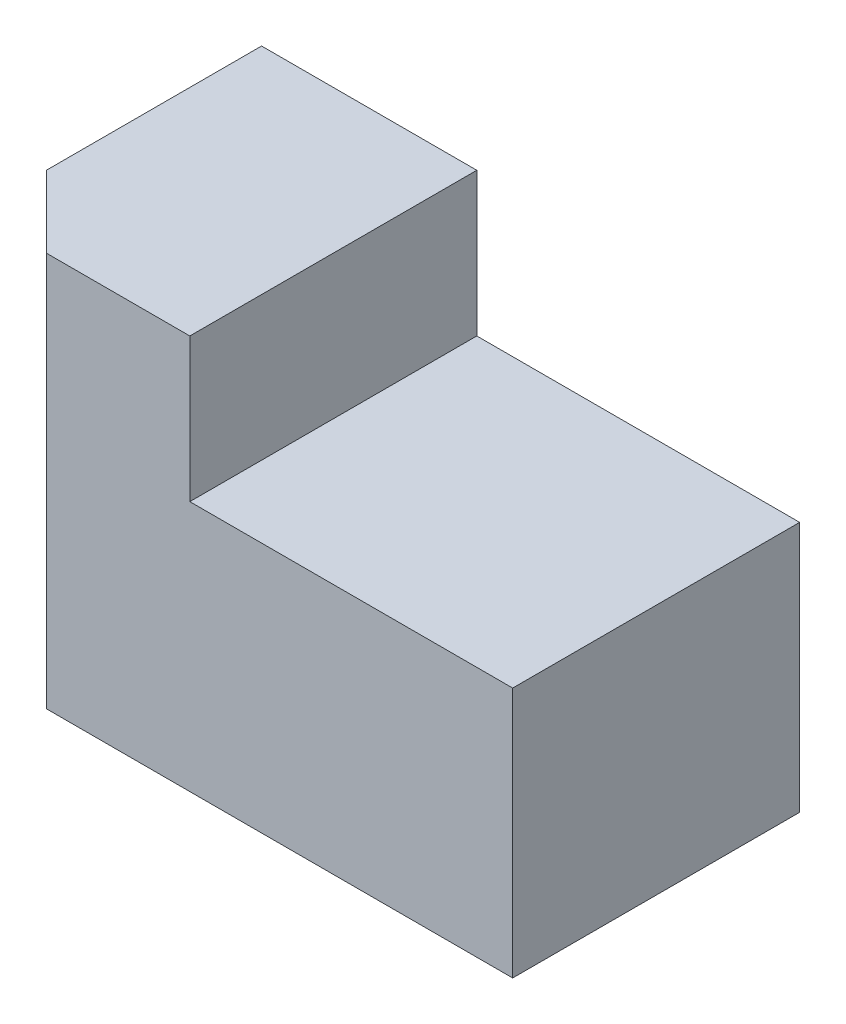
ISO-10303-21;
HEADER;
FILE_DESCRIPTION(('STEP AP214'),'2;1');
FILE_NAME('part.step','',(''),(''),'','','');
FILE_SCHEMA(('AUTOMOTIVE_DESIGN { 1 0 10303 214 1 1 1 1 }'));
ENDSEC;
DATA;
#1=APPLICATION_CONTEXT('core data for automotive mechanical design processes');
#2=APPLICATION_PROTOCOL_DEFINITION('international standard','automotive_design',2000,#1);
#3=PRODUCT_CONTEXT('',#1,'mechanical');
#4=PRODUCT('Part','Part','',(#3));
#5=PRODUCT_RELATED_PRODUCT_CATEGORY('part','',(#4));
#6=PRODUCT_DEFINITION_FORMATION('','',#4);
#7=PRODUCT_DEFINITION_CONTEXT('part definition',#1,'design');
#8=PRODUCT_DEFINITION('design','',#6,#7);
#9=PRODUCT_DEFINITION_SHAPE('','',#8);
#10=(LENGTH_UNIT() NAMED_UNIT(*) SI_UNIT(.MILLI.,.METRE.));
#11=(NAMED_UNIT(*) PLANE_ANGLE_UNIT() SI_UNIT($,.RADIAN.));
#12=(NAMED_UNIT(*) SI_UNIT($,.STERADIAN.) SOLID_ANGLE_UNIT());
#13=UNCERTAINTY_MEASURE_WITH_UNIT(LENGTH_MEASURE(1.E-05),#10,'distance_accuracy_value','');
#14=(GEOMETRIC_REPRESENTATION_CONTEXT(3) GLOBAL_UNCERTAINTY_ASSIGNED_CONTEXT((#13)) GLOBAL_UNIT_ASSIGNED_CONTEXT((#10,
#11,#12)) REPRESENTATION_CONTEXT('',''));
#15=CARTESIAN_POINT('',(0.,0.,0.));
#16=DIRECTION('',(0.,0.,1.));
#17=DIRECTION('',(1.,0.,0.));
#18=AXIS2_PLACEMENT_3D('',#15,#16,#17);
#19=CARTESIAN_POINT('',(0.,0.,0.));
#20=DIRECTION('',(0.,-1.,0.));
#21=DIRECTION('',(0.,0.,-1.));
#22=AXIS2_PLACEMENT_3D('',#19,#20,#21);
#23=PLANE('',#22);
#24=DIRECTION('',(0.707106781186548,0.,0.707106781186547));
#25=VECTOR('',#24,1.);
#26=CARTESIAN_POINT('',(12.7,0.,12.7));
#27=LINE('',#26,#25);
#28=CARTESIAN_POINT('',(0.,0.,0.));
#29=VERTEX_POINT('',#28);
#30=CARTESIAN_POINT('',(12.7,0.,12.7));
#31=VERTEX_POINT('',#30);
#32=EDGE_CURVE('E375',#29,#31,#27,.T.);
#33=ORIENTED_EDGE('',*,*,#32,.F.);
#34=DIRECTION('',(0.,0.,1.));
#35=VECTOR('',#34,1.);
#36=CARTESIAN_POINT('',(0.,0.,0.));
#37=LINE('',#36,#35);
#38=CARTESIAN_POINT('',(0.,0.,-38.1));
#39=VERTEX_POINT('',#38);
#40=EDGE_CURVE('E380',#39,#29,#37,.T.);
#41=ORIENTED_EDGE('',*,*,#40,.F.);
#42=DIRECTION('',(-1.,0.,0.));
#43=VECTOR('',#42,1.);
#44=CARTESIAN_POINT('',(0.,0.,-38.1));
#45=LINE('',#44,#43);
#46=CARTESIAN_POINT('',(95.25,0.,-38.1));
#47=VERTEX_POINT('',#46);
#48=EDGE_CURVE('E393',#47,#39,#45,.T.);
#49=ORIENTED_EDGE('',*,*,#48,.F.);
#50=DIRECTION('',(0.,0.,-1.));
#51=VECTOR('',#50,1.);
#52=CARTESIAN_POINT('',(95.25,0.,12.7));
#53=LINE('',#52,#51);
#54=CARTESIAN_POINT('',(95.25,0.,12.7));
#55=VERTEX_POINT('',#54);
#56=EDGE_CURVE('E360',#55,#47,#53,.T.);
#57=ORIENTED_EDGE('',*,*,#56,.F.);
#58=DIRECTION('',(1.,0.,0.));
#59=VECTOR('',#58,1.);
#60=CARTESIAN_POINT('',(12.7,0.,12.7));
#61=LINE('',#60,#59);
#62=EDGE_CURVE('E391',#31,#55,#61,.T.);
#63=ORIENTED_EDGE('',*,*,#62,.F.);
#64=EDGE_LOOP('',(#33,#41,#49,#57,#63));
#65=FACE_BOUND('',#64,.T.);
#66=DIRECTION('',(1.,0.,0.));
#67=VECTOR('',#66,1.);
#68=CARTESIAN_POINT('',(50.8,0.,-31.75));
#69=LINE('',#68,#67);
#70=CARTESIAN_POINT('',(50.8,0.,-31.75));
#71=VERTEX_POINT('',#70);
#72=CARTESIAN_POINT('',(57.15,0.,-31.75));
#73=VERTEX_POINT('',#72);
#74=EDGE_CURVE('E341',#71,#73,#69,.T.);
#75=ORIENTED_EDGE('',*,*,#74,.F.);
#76=DIRECTION('',(0.,0.,-1.));
#77=VECTOR('',#76,1.);
#78=CARTESIAN_POINT('',(50.8,0.,6.35000000000001));
#79=LINE('',#78,#77);
#80=CARTESIAN_POINT('',(50.8,0.,6.35000000000001));
#81=VERTEX_POINT('',#80);
#82=EDGE_CURVE('E327',#81,#71,#79,.T.);
#83=ORIENTED_EDGE('',*,*,#82,.F.);
#84=DIRECTION('',(-1.,0.,0.));
#85=VECTOR('',#84,1.);
#86=CARTESIAN_POINT('',(50.8,0.,6.35000000000001));
#87=LINE('',#86,#85);
#88=CARTESIAN_POINT('',(57.15,0.,6.35000000000001));
#89=VERTEX_POINT('',#88);
#90=EDGE_CURVE('E332',#89,#81,#87,.T.);
#91=ORIENTED_EDGE('',*,*,#90,.F.);
#92=DIRECTION('',(0.,0.,1.));
#93=VECTOR('',#92,1.);
#94=CARTESIAN_POINT('',(57.15,0.,6.35000000000001));
#95=LINE('',#94,#93);
#96=EDGE_CURVE('E343',#73,#89,#95,.T.);
#97=ORIENTED_EDGE('',*,*,#96,.F.);
#98=EDGE_LOOP('',(#75,#83,#91,#97));
#99=FACE_BOUND('',#98,.T.);
#100=DIRECTION('',(1.,0.,0.));
#101=VECTOR('',#100,1.);
#102=CARTESIAN_POINT('',(38.1,0.,-31.75));
#103=LINE('',#102,#101);
#104=CARTESIAN_POINT('',(38.1,0.,-31.75));
#105=VERTEX_POINT('',#104);
#106=CARTESIAN_POINT('',(44.45,0.,-31.75));
#107=VERTEX_POINT('',#106);
#108=EDGE_CURVE('E312',#105,#107,#103,.T.);
#109=ORIENTED_EDGE('',*,*,#108,.F.);
#110=DIRECTION('',(0.,0.,-1.));
#111=VECTOR('',#110,1.);
#112=CARTESIAN_POINT('',(38.1,0.,6.35000000000001));
#113=LINE('',#112,#111);
#114=CARTESIAN_POINT('',(38.1,0.,6.35000000000001));
#115=VERTEX_POINT('',#114);
#116=EDGE_CURVE('E298',#115,#105,#113,.T.);
#117=ORIENTED_EDGE('',*,*,#116,.F.);
#118=DIRECTION('',(-1.,0.,0.));
#119=VECTOR('',#118,1.);
#120=CARTESIAN_POINT('',(38.1,0.,6.35000000000001));
#121=LINE('',#120,#119);
#122=CARTESIAN_POINT('',(44.45,0.,6.35000000000001));
#123=VERTEX_POINT('',#122);
#124=EDGE_CURVE('E303',#123,#115,#121,.T.);
#125=ORIENTED_EDGE('',*,*,#124,.F.);
#126=DIRECTION('',(0.,0.,1.));
#127=VECTOR('',#126,1.);
#128=CARTESIAN_POINT('',(44.45,0.,6.35000000000001));
#129=LINE('',#128,#127);
#130=EDGE_CURVE('E314',#107,#123,#129,.T.);
#131=ORIENTED_EDGE('',*,*,#130,.F.);
#132=EDGE_LOOP('',(#109,#117,#125,#131));
#133=FACE_BOUND('',#132,.T.);
#134=DIRECTION('',(1.,0.,0.));
#135=VECTOR('',#134,1.);
#136=CARTESIAN_POINT('',(25.4,0.,-31.75));
#137=LINE('',#136,#135);
#138=CARTESIAN_POINT('',(25.4,0.,-31.75));
#139=VERTEX_POINT('',#138);
#140=CARTESIAN_POINT('',(31.75,0.,-31.75));
#141=VERTEX_POINT('',#140);
#142=EDGE_CURVE('E283',#139,#141,#137,.T.);
#143=ORIENTED_EDGE('',*,*,#142,.F.);
#144=DIRECTION('',(0.,0.,-1.));
#145=VECTOR('',#144,1.);
#146=CARTESIAN_POINT('',(25.4,0.,6.35));
#147=LINE('',#146,#145);
#148=CARTESIAN_POINT('',(25.4,0.,6.35));
#149=VERTEX_POINT('',#148);
#150=EDGE_CURVE('E269',#149,#139,#147,.T.);
#151=ORIENTED_EDGE('',*,*,#150,.F.);
#152=DIRECTION('',(-1.,0.,0.));
#153=VECTOR('',#152,1.);
#154=CARTESIAN_POINT('',(25.4,0.,6.35));
#155=LINE('',#154,#153);
#156=CARTESIAN_POINT('',(31.75,0.,6.35));
#157=VERTEX_POINT('',#156);
#158=EDGE_CURVE('E274',#157,#149,#155,.T.);
#159=ORIENTED_EDGE('',*,*,#158,.F.);
#160=DIRECTION('',(0.,0.,1.));
#161=VECTOR('',#160,1.);
#162=CARTESIAN_POINT('',(31.75,0.,6.35));
#163=LINE('',#162,#161);
#164=EDGE_CURVE('E285',#141,#157,#163,.T.);
#165=ORIENTED_EDGE('',*,*,#164,.F.);
#166=EDGE_LOOP('',(#143,#151,#159,#165));
#167=FACE_BOUND('',#166,.T.);
#168=DIRECTION('',(1.,0.,0.));
#169=VECTOR('',#168,1.);
#170=CARTESIAN_POINT('',(63.5,0.,-31.75));
#171=LINE('',#170,#169);
#172=CARTESIAN_POINT('',(63.5,0.,-31.75));
#173=VERTEX_POINT('',#172);
#174=CARTESIAN_POINT('',(69.85,0.,-31.75));
#175=VERTEX_POINT('',#174);
#176=EDGE_CURVE('E241',#173,#175,#171,.T.);
#177=ORIENTED_EDGE('',*,*,#176,.F.);
#178=DIRECTION('',(0.,0.,-1.));
#179=VECTOR('',#178,1.);
#180=CARTESIAN_POINT('',(63.5,0.,6.35000000000001));
#181=LINE('',#180,#179);
#182=CARTESIAN_POINT('',(63.5,0.,6.35000000000001));
#183=VERTEX_POINT('',#182);
#184=EDGE_CURVE('E238',#183,#173,#181,.T.);
#185=ORIENTED_EDGE('',*,*,#184,.F.);
#186=DIRECTION('',(-1.,0.,0.));
#187=VECTOR('',#186,1.);
#188=CARTESIAN_POINT('',(63.5,0.,6.35000000000001));
#189=LINE('',#188,#187);
#190=CARTESIAN_POINT('',(69.85,0.,6.35000000000001));
#191=VERTEX_POINT('',#190);
#192=EDGE_CURVE('E250',#191,#183,#189,.T.);
#193=ORIENTED_EDGE('',*,*,#192,.F.);
#194=DIRECTION('',(0.,0.,1.));
#195=VECTOR('',#194,1.);
#196=CARTESIAN_POINT('',(69.85,0.,6.35000000000001));
#197=LINE('',#196,#195);
#198=EDGE_CURVE('E258',#175,#191,#197,.T.);
#199=ORIENTED_EDGE('',*,*,#198,.F.);
#200=EDGE_LOOP('',(#177,#185,#193,#199));
#201=FACE_BOUND('',#200,.T.);
#202=DIRECTION('',(1.,0.,0.));
#203=VECTOR('',#202,1.);
#204=CARTESIAN_POINT('',(76.2,0.,-31.75));
#205=LINE('',#204,#203);
#206=CARTESIAN_POINT('',(76.2,0.,-31.75));
#207=VERTEX_POINT('',#206);
#208=CARTESIAN_POINT('',(82.55,0.,-31.75));
#209=VERTEX_POINT('',#208);
#210=EDGE_CURVE('E765',#207,#209,#205,.T.);
#211=ORIENTED_EDGE('',*,*,#210,.F.);
#212=DIRECTION('',(0.,0.,-1.));
#213=VECTOR('',#212,1.);
#214=CARTESIAN_POINT('',(76.2,0.,6.35000000000001));
#215=LINE('',#214,#213);
#216=CARTESIAN_POINT('',(76.2,0.,6.35000000000001));
#217=VERTEX_POINT('',#216);
#218=EDGE_CURVE('E236',#217,#207,#215,.T.);
#219=ORIENTED_EDGE('',*,*,#218,.F.);
#220=DIRECTION('',(-1.,0.,0.));
#221=VECTOR('',#220,1.);
#222=CARTESIAN_POINT('',(76.2,0.,6.35000000000001));
#223=LINE('',#222,#221);
#224=CARTESIAN_POINT('',(82.55,0.,6.35000000000001));
#225=VERTEX_POINT('',#224);
#226=EDGE_CURVE('E232',#225,#217,#223,.T.);
#227=ORIENTED_EDGE('',*,*,#226,.F.);
#228=DIRECTION('',(0.,0.,1.));
#229=VECTOR('',#228,1.);
#230=CARTESIAN_POINT('',(82.55,0.,6.35000000000001));
#231=LINE('',#230,#229);
#232=EDGE_CURVE('E762',#209,#225,#231,.T.);
#233=ORIENTED_EDGE('',*,*,#232,.F.);
#234=EDGE_LOOP('',(#211,#219,#227,#233));
#235=FACE_BOUND('',#234,.T.);
#236=ADVANCED_FACE('F33',(#65,#99,#133,#167,#201,#235),#23,.T.);
#237=CARTESIAN_POINT('',(38.1,69.85,-38.1));
#238=DIRECTION('',(-1.,0.,0.));
#239=DIRECTION('',(0.,0.,1.));
#240=AXIS2_PLACEMENT_3D('',#237,#238,#239);
#241=PLANE('',#240);
#242=DIRECTION('',(0.,0.,1.));
#243=VECTOR('',#242,1.);
#244=CARTESIAN_POINT('',(38.1,44.45,12.7));
#245=LINE('',#244,#243);
#246=CARTESIAN_POINT('',(38.1,44.45,-38.1));
#247=VERTEX_POINT('',#246);
#248=CARTESIAN_POINT('',(38.1,44.45,12.7));
#249=VERTEX_POINT('',#248);
#250=EDGE_CURVE('E356',#247,#249,#245,.T.);
#251=ORIENTED_EDGE('',*,*,#250,.F.);
#252=DIRECTION('',(0.,-1.,0.));
#253=VECTOR('',#252,1.);
#254=CARTESIAN_POINT('',(38.1,69.85,-38.1));
#255=LINE('',#254,#253);
#256=CARTESIAN_POINT('',(38.1,69.85,-38.1));
#257=VERTEX_POINT('',#256);
#258=EDGE_CURVE('E401',#257,#247,#255,.T.);
#259=ORIENTED_EDGE('',*,*,#258,.F.);
#260=DIRECTION('',(0.,0.,-1.));
#261=VECTOR('',#260,1.);
#262=CARTESIAN_POINT('',(38.1,69.85,-38.1));
#263=LINE('',#262,#261);
#264=CARTESIAN_POINT('',(38.1,69.85,12.7));
#265=VERTEX_POINT('',#264);
#266=EDGE_CURVE('E382',#265,#257,#263,.T.);
#267=ORIENTED_EDGE('',*,*,#266,.F.);
#268=DIRECTION('',(0.,-1.,0.));
#269=VECTOR('',#268,1.);
#270=CARTESIAN_POINT('',(38.1,69.85,12.7));
#271=LINE('',#270,#269);
#272=EDGE_CURVE('E41',#265,#249,#271,.T.);
#273=ORIENTED_EDGE('',*,*,#272,.T.);
#274=EDGE_LOOP('',(#251,#259,#267,#273));
#275=FACE_BOUND('',#274,.T.);
#276=ADVANCED_FACE('F406',(#275),#241,.F.);
#277=CARTESIAN_POINT('',(12.7,69.85,12.7));
#278=DIRECTION('',(0.707106781186547,0.,-0.707106781186548));
#279=DIRECTION('',(-0.707106781186548,0.,-0.707106781186547));
#280=AXIS2_PLACEMENT_3D('',#277,#278,#279);
#281=PLANE('',#280);
#282=ORIENTED_EDGE('',*,*,#32,.T.);
#283=DIRECTION('',(0.,-1.,0.));
#284=VECTOR('',#283,1.);
#285=CARTESIAN_POINT('',(12.7,69.85,12.7));
#286=LINE('',#285,#284);
#287=CARTESIAN_POINT('',(12.7,69.85,12.7));
#288=VERTEX_POINT('',#287);
#289=EDGE_CURVE('E11',#288,#31,#286,.T.);
#290=ORIENTED_EDGE('',*,*,#289,.F.);
#291=DIRECTION('',(0.707106781186548,0.,0.707106781186547));
#292=VECTOR('',#291,1.);
#293=CARTESIAN_POINT('',(12.7,69.85,12.7));
#294=LINE('',#293,#292);
#295=CARTESIAN_POINT('',(0.,69.85,0.));
#296=VERTEX_POINT('',#295);
#297=EDGE_CURVE('E376',#296,#288,#294,.T.);
#298=ORIENTED_EDGE('',*,*,#297,.F.);
#299=DIRECTION('',(0.,-1.,0.));
#300=VECTOR('',#299,1.);
#301=CARTESIAN_POINT('',(0.,69.85,0.));
#302=LINE('',#301,#300);
#303=EDGE_CURVE('E388',#296,#29,#302,.T.);
#304=ORIENTED_EDGE('',*,*,#303,.T.);
#305=EDGE_LOOP('',(#282,#290,#298,#304));
#306=FACE_BOUND('',#305,.T.);
#307=ADVANCED_FACE('F35',(#306),#281,.F.);
#308=CARTESIAN_POINT('',(12.7,69.85,12.7));
#309=DIRECTION('',(0.,0.,-1.));
#310=DIRECTION('',(-1.,0.,0.));
#311=AXIS2_PLACEMENT_3D('',#308,#309,#310);
#312=PLANE('',#311);
#313=ORIENTED_EDGE('',*,*,#62,.T.);
#314=DIRECTION('',(0.,-1.,0.));
#315=VECTOR('',#314,1.);
#316=CARTESIAN_POINT('',(95.25,0.,12.7));
#317=LINE('',#316,#315);
#318=CARTESIAN_POINT('',(95.25,44.45,12.7));
#319=VERTEX_POINT('',#318);
#320=EDGE_CURVE('E357',#319,#55,#317,.T.);
#321=ORIENTED_EDGE('',*,*,#320,.F.);
#322=DIRECTION('',(-1.,0.,0.));
#323=VECTOR('',#322,1.);
#324=CARTESIAN_POINT('',(95.25,44.45,12.7));
#325=LINE('',#324,#323);
#326=EDGE_CURVE('E367',#319,#249,#325,.T.);
#327=ORIENTED_EDGE('',*,*,#326,.T.);
#328=ORIENTED_EDGE('',*,*,#272,.F.);
#329=DIRECTION('',(1.,0.,0.));
#330=VECTOR('',#329,1.);
#331=CARTESIAN_POINT('',(12.7,69.85,12.7));
#332=LINE('',#331,#330);
#333=EDGE_CURVE('E379',#288,#265,#332,.T.);
#334=ORIENTED_EDGE('',*,*,#333,.F.);
#335=ORIENTED_EDGE('',*,*,#289,.T.);
#336=EDGE_LOOP('',(#313,#321,#327,#328,#334,#335));
#337=FACE_BOUND('',#336,.T.);
#338=ADVANCED_FACE('F415',(#337),#312,.F.);
#339=CARTESIAN_POINT('',(0.,69.85,-38.1));
#340=DIRECTION('',(0.,0.,1.));
#341=DIRECTION('',(1.,0.,0.));
#342=AXIS2_PLACEMENT_3D('',#339,#340,#341);
#343=PLANE('',#342);
#344=ORIENTED_EDGE('',*,*,#48,.T.);
#345=DIRECTION('',(0.,-1.,0.));
#346=VECTOR('',#345,1.);
#347=CARTESIAN_POINT('',(0.,69.85,-38.1));
#348=LINE('',#347,#346);
#349=CARTESIAN_POINT('',(0.,69.85,-38.1));
#350=VERTEX_POINT('',#349);
#351=EDGE_CURVE('E398',#350,#39,#348,.T.);
#352=ORIENTED_EDGE('',*,*,#351,.F.);
#353=DIRECTION('',(-1.,0.,0.));
#354=VECTOR('',#353,1.);
#355=CARTESIAN_POINT('',(0.,69.85,-38.1));
#356=LINE('',#355,#354);
#357=EDGE_CURVE('E384',#257,#350,#356,.T.);
#358=ORIENTED_EDGE('',*,*,#357,.F.);
#359=ORIENTED_EDGE('',*,*,#258,.T.);
#360=DIRECTION('',(-1.,0.,0.));
#361=VECTOR('',#360,1.);
#362=CARTESIAN_POINT('',(95.25,44.45,-38.1));
#363=LINE('',#362,#361);
#364=CARTESIAN_POINT('',(95.25,44.45,-38.1));
#365=VERTEX_POINT('',#364);
#366=EDGE_CURVE('E372',#365,#247,#363,.T.);
#367=ORIENTED_EDGE('',*,*,#366,.F.);
#368=DIRECTION('',(0.,1.,0.));
#369=VECTOR('',#368,1.);
#370=CARTESIAN_POINT('',(95.25,0.,-38.1));
#371=LINE('',#370,#369);
#372=EDGE_CURVE('E363',#47,#365,#371,.T.);
#373=ORIENTED_EDGE('',*,*,#372,.F.);
#374=EDGE_LOOP('',(#344,#352,#358,#359,#367,#373));
#375=FACE_BOUND('',#374,.T.);
#376=ADVANCED_FACE('F421',(#375),#343,.F.);
#377=CARTESIAN_POINT('',(0.,69.85,0.));
#378=DIRECTION('',(1.,0.,0.));
#379=DIRECTION('',(0.,0.,-1.));
#380=AXIS2_PLACEMENT_3D('',#377,#378,#379);
#381=PLANE('',#380);
#382=ORIENTED_EDGE('',*,*,#40,.T.);
#383=ORIENTED_EDGE('',*,*,#303,.F.);
#384=DIRECTION('',(0.,0.,1.));
#385=VECTOR('',#384,1.);
#386=CARTESIAN_POINT('',(0.,69.85,0.));
#387=LINE('',#386,#385);
#388=EDGE_CURVE('E386',#350,#296,#387,.T.);
#389=ORIENTED_EDGE('',*,*,#388,.F.);
#390=ORIENTED_EDGE('',*,*,#351,.T.);
#391=EDGE_LOOP('',(#382,#383,#389,#390));
#392=FACE_BOUND('',#391,.T.);
#393=ADVANCED_FACE('F436',(#392),#381,.F.);
#394=CARTESIAN_POINT('',(0.,69.85,0.));
#395=DIRECTION('',(0.,-1.,0.));
#396=DIRECTION('',(0.,0.,-1.));
#397=AXIS2_PLACEMENT_3D('',#394,#395,#396);
#398=PLANE('',#397);
#399=ORIENTED_EDGE('',*,*,#297,.T.);
#400=ORIENTED_EDGE('',*,*,#333,.T.);
#401=ORIENTED_EDGE('',*,*,#266,.T.);
#402=ORIENTED_EDGE('',*,*,#357,.T.);
#403=ORIENTED_EDGE('',*,*,#388,.T.);
#404=EDGE_LOOP('',(#399,#400,#401,#402,#403));
#405=FACE_BOUND('',#404,.T.);
#406=ADVANCED_FACE('F426',(#405),#398,.F.);
#407=CARTESIAN_POINT('',(95.25,44.45,12.7));
#408=DIRECTION('',(0.,-1.,0.));
#409=DIRECTION('',(0.,0.,-1.));
#410=AXIS2_PLACEMENT_3D('',#407,#408,#409);
#411=PLANE('',#410);
#412=ORIENTED_EDGE('',*,*,#250,.T.);
#413=ORIENTED_EDGE('',*,*,#326,.F.);
#414=DIRECTION('',(0.,0.,1.));
#415=VECTOR('',#414,1.);
#416=CARTESIAN_POINT('',(95.25,44.45,12.7));
#417=LINE('',#416,#415);
#418=EDGE_CURVE('E365',#365,#319,#417,.T.);
#419=ORIENTED_EDGE('',*,*,#418,.F.);
#420=ORIENTED_EDGE('',*,*,#366,.T.);
#421=EDGE_LOOP('',(#412,#413,#419,#420));
#422=FACE_BOUND('',#421,.T.);
#423=ADVANCED_FACE('F411',(#422),#411,.F.);
#424=CARTESIAN_POINT('',(95.25,0.,0.));
#425=DIRECTION('',(-1.,0.,0.));
#426=DIRECTION('',(0.,0.,1.));
#427=AXIS2_PLACEMENT_3D('',#424,#425,#426);
#428=PLANE('',#427);
#429=ORIENTED_EDGE('',*,*,#320,.T.);
#430=ORIENTED_EDGE('',*,*,#56,.T.);
#431=ORIENTED_EDGE('',*,*,#372,.T.);
#432=ORIENTED_EDGE('',*,*,#418,.T.);
#433=EDGE_LOOP('',(#429,#430,#431,#432));
#434=FACE_BOUND('',#433,.T.);
#435=ADVANCED_FACE('F418',(#434),#428,.F.);
#436=CARTESIAN_POINT('',(50.8,-6.35,6.35000000000001));
#437=DIRECTION('',(1.,0.,0.));
#438=DIRECTION('',(0.,0.,-1.));
#439=AXIS2_PLACEMENT_3D('',#436,#437,#438);
#440=PLANE('',#439);
#441=ORIENTED_EDGE('',*,*,#82,.T.);
#442=DIRECTION('',(0.,1.,0.));
#443=VECTOR('',#442,1.);
#444=CARTESIAN_POINT('',(50.8,-6.35,-31.75));
#445=LINE('',#444,#443);
#446=CARTESIAN_POINT('',(50.8,-6.35,-31.75));
#447=VERTEX_POINT('',#446);
#448=EDGE_CURVE('E354',#447,#71,#445,.T.);
#449=ORIENTED_EDGE('',*,*,#448,.F.);
#450=DIRECTION('',(0.,0.,-1.));
#451=VECTOR('',#450,1.);
#452=CARTESIAN_POINT('',(50.8,-6.35,6.35000000000001));
#453=LINE('',#452,#451);
#454=CARTESIAN_POINT('',(50.8,-6.35,6.35000000000001));
#455=VERTEX_POINT('',#454);
#456=EDGE_CURVE('E328',#455,#447,#453,.T.);
#457=ORIENTED_EDGE('',*,*,#456,.F.);
#458=DIRECTION('',(0.,1.,0.));
#459=VECTOR('',#458,1.);
#460=CARTESIAN_POINT('',(50.8,-6.35,6.35000000000001));
#461=LINE('',#460,#459);
#462=EDGE_CURVE('E338',#455,#81,#461,.T.);
#463=ORIENTED_EDGE('',*,*,#462,.T.);
#464=EDGE_LOOP('',(#441,#449,#457,#463));
#465=FACE_BOUND('',#464,.T.);
#466=ADVANCED_FACE('F456',(#465),#440,.F.);
#467=CARTESIAN_POINT('',(50.8,-6.35,-31.75));
#468=DIRECTION('',(0.,0.,1.));
#469=DIRECTION('',(1.,0.,0.));
#470=AXIS2_PLACEMENT_3D('',#467,#468,#469);
#471=PLANE('',#470);
#472=ORIENTED_EDGE('',*,*,#74,.T.);
#473=DIRECTION('',(0.,1.,0.));
#474=VECTOR('',#473,1.);
#475=CARTESIAN_POINT('',(57.15,-6.35,-31.75));
#476=LINE('',#475,#474);
#477=CARTESIAN_POINT('',(57.15,-6.35,-31.75));
#478=VERTEX_POINT('',#477);
#479=EDGE_CURVE('E351',#478,#73,#476,.T.);
#480=ORIENTED_EDGE('',*,*,#479,.F.);
#481=DIRECTION('',(1.,0.,0.));
#482=VECTOR('',#481,1.);
#483=CARTESIAN_POINT('',(50.8,-6.35,-31.75));
#484=LINE('',#483,#482);
#485=EDGE_CURVE('E331',#447,#478,#484,.T.);
#486=ORIENTED_EDGE('',*,*,#485,.F.);
#487=ORIENTED_EDGE('',*,*,#448,.T.);
#488=EDGE_LOOP('',(#472,#480,#486,#487));
#489=FACE_BOUND('',#488,.T.);
#490=ADVANCED_FACE('F459',(#489),#471,.F.);
#491=CARTESIAN_POINT('',(57.15,-6.35,6.35000000000001));
#492=DIRECTION('',(-1.,0.,0.));
#493=DIRECTION('',(0.,0.,1.));
#494=AXIS2_PLACEMENT_3D('',#491,#492,#493);
#495=PLANE('',#494);
#496=ORIENTED_EDGE('',*,*,#96,.T.);
#497=DIRECTION('',(0.,1.,0.));
#498=VECTOR('',#497,1.);
#499=CARTESIAN_POINT('',(57.15,-6.35,6.35000000000001));
#500=LINE('',#499,#498);
#501=CARTESIAN_POINT('',(57.15,-6.35,6.35000000000001));
#502=VERTEX_POINT('',#501);
#503=EDGE_CURVE('E349',#502,#89,#500,.T.);
#504=ORIENTED_EDGE('',*,*,#503,.F.);
#505=DIRECTION('',(0.,0.,1.));
#506=VECTOR('',#505,1.);
#507=CARTESIAN_POINT('',(57.15,-6.35,6.35000000000001));
#508=LINE('',#507,#506);
#509=EDGE_CURVE('E334',#478,#502,#508,.T.);
#510=ORIENTED_EDGE('',*,*,#509,.F.);
#511=ORIENTED_EDGE('',*,*,#479,.T.);
#512=EDGE_LOOP('',(#496,#504,#510,#511));
#513=FACE_BOUND('',#512,.T.);
#514=ADVANCED_FACE('F463',(#513),#495,.F.);
#515=CARTESIAN_POINT('',(50.8,-6.35,6.35000000000001));
#516=DIRECTION('',(0.,0.,-1.));
#517=DIRECTION('',(-1.,0.,0.));
#518=AXIS2_PLACEMENT_3D('',#515,#516,#517);
#519=PLANE('',#518);
#520=ORIENTED_EDGE('',*,*,#90,.T.);
#521=ORIENTED_EDGE('',*,*,#462,.F.);
#522=DIRECTION('',(-1.,0.,0.));
#523=VECTOR('',#522,1.);
#524=CARTESIAN_POINT('',(50.8,-6.35,6.35000000000001));
#525=LINE('',#524,#523);
#526=EDGE_CURVE('E336',#502,#455,#525,.T.);
#527=ORIENTED_EDGE('',*,*,#526,.F.);
#528=ORIENTED_EDGE('',*,*,#503,.T.);
#529=EDGE_LOOP('',(#520,#521,#527,#528));
#530=FACE_BOUND('',#529,.T.);
#531=ADVANCED_FACE('F467',(#530),#519,.F.);
#532=CARTESIAN_POINT('',(0.,-6.35,0.));
#533=DIRECTION('',(0.,-1.,0.));
#534=DIRECTION('',(0.,0.,-1.));
#535=AXIS2_PLACEMENT_3D('',#532,#533,#534);
#536=PLANE('',#535);
#537=ORIENTED_EDGE('',*,*,#456,.T.);
#538=ORIENTED_EDGE('',*,*,#485,.T.);
#539=ORIENTED_EDGE('',*,*,#509,.T.);
#540=ORIENTED_EDGE('',*,*,#526,.T.);
#541=EDGE_LOOP('',(#537,#538,#539,#540));
#542=FACE_BOUND('',#541,.T.);
#543=ADVANCED_FACE('F471',(#542),#536,.T.);
#544=CARTESIAN_POINT('',(38.1,-6.35,6.35000000000001));
#545=DIRECTION('',(1.,0.,0.));
#546=DIRECTION('',(0.,0.,-1.));
#547=AXIS2_PLACEMENT_3D('',#544,#545,#546);
#548=PLANE('',#547);
#549=ORIENTED_EDGE('',*,*,#116,.T.);
#550=DIRECTION('',(0.,1.,0.));
#551=VECTOR('',#550,1.);
#552=CARTESIAN_POINT('',(38.1,-6.35,-31.75));
#553=LINE('',#552,#551);
#554=CARTESIAN_POINT('',(38.1,-6.35,-31.75));
#555=VERTEX_POINT('',#554);
#556=EDGE_CURVE('E325',#555,#105,#553,.T.);
#557=ORIENTED_EDGE('',*,*,#556,.F.);
#558=DIRECTION('',(0.,0.,-1.));
#559=VECTOR('',#558,1.);
#560=CARTESIAN_POINT('',(38.1,-6.35,6.35000000000001));
#561=LINE('',#560,#559);
#562=CARTESIAN_POINT('',(38.1,-6.35,6.35000000000001));
#563=VERTEX_POINT('',#562);
#564=EDGE_CURVE('E299',#563,#555,#561,.T.);
#565=ORIENTED_EDGE('',*,*,#564,.F.);
#566=DIRECTION('',(0.,1.,0.));
#567=VECTOR('',#566,1.);
#568=CARTESIAN_POINT('',(38.1,-6.35,6.35000000000001));
#569=LINE('',#568,#567);
#570=EDGE_CURVE('E309',#563,#115,#569,.T.);
#571=ORIENTED_EDGE('',*,*,#570,.T.);
#572=EDGE_LOOP('',(#549,#557,#565,#571));
#573=FACE_BOUND('',#572,.T.);
#574=ADVANCED_FACE('F475',(#573),#548,.F.);
#575=CARTESIAN_POINT('',(38.1,-6.35,-31.75));
#576=DIRECTION('',(0.,0.,1.));
#577=DIRECTION('',(1.,0.,0.));
#578=AXIS2_PLACEMENT_3D('',#575,#576,#577);
#579=PLANE('',#578);
#580=ORIENTED_EDGE('',*,*,#108,.T.);
#581=DIRECTION('',(0.,1.,0.));
#582=VECTOR('',#581,1.);
#583=CARTESIAN_POINT('',(44.45,-6.35,-31.75));
#584=LINE('',#583,#582);
#585=CARTESIAN_POINT('',(44.45,-6.35,-31.75));
#586=VERTEX_POINT('',#585);
#587=EDGE_CURVE('E322',#586,#107,#584,.T.);
#588=ORIENTED_EDGE('',*,*,#587,.F.);
#589=DIRECTION('',(1.,0.,0.));
#590=VECTOR('',#589,1.);
#591=CARTESIAN_POINT('',(38.1,-6.35,-31.75));
#592=LINE('',#591,#590);
#593=EDGE_CURVE('E302',#555,#586,#592,.T.);
#594=ORIENTED_EDGE('',*,*,#593,.F.);
#595=ORIENTED_EDGE('',*,*,#556,.T.);
#596=EDGE_LOOP('',(#580,#588,#594,#595));
#597=FACE_BOUND('',#596,.T.);
#598=ADVANCED_FACE('F479',(#597),#579,.F.);
#599=CARTESIAN_POINT('',(44.45,-6.35,6.35000000000001));
#600=DIRECTION('',(-1.,0.,0.));
#601=DIRECTION('',(0.,0.,1.));
#602=AXIS2_PLACEMENT_3D('',#599,#600,#601);
#603=PLANE('',#602);
#604=ORIENTED_EDGE('',*,*,#130,.T.);
#605=DIRECTION('',(0.,1.,0.));
#606=VECTOR('',#605,1.);
#607=CARTESIAN_POINT('',(44.45,-6.35,6.35000000000001));
#608=LINE('',#607,#606);
#609=CARTESIAN_POINT('',(44.45,-6.35,6.35000000000001));
#610=VERTEX_POINT('',#609);
#611=EDGE_CURVE('E320',#610,#123,#608,.T.);
#612=ORIENTED_EDGE('',*,*,#611,.F.);
#613=DIRECTION('',(0.,0.,1.));
#614=VECTOR('',#613,1.);
#615=CARTESIAN_POINT('',(44.45,-6.35,6.35000000000001));
#616=LINE('',#615,#614);
#617=EDGE_CURVE('E305',#586,#610,#616,.T.);
#618=ORIENTED_EDGE('',*,*,#617,.F.);
#619=ORIENTED_EDGE('',*,*,#587,.T.);
#620=EDGE_LOOP('',(#604,#612,#618,#619));
#621=FACE_BOUND('',#620,.T.);
#622=ADVANCED_FACE('F483',(#621),#603,.F.);
#623=CARTESIAN_POINT('',(38.1,-6.35,6.35000000000001));
#624=DIRECTION('',(0.,0.,-1.));
#625=DIRECTION('',(-1.,0.,0.));
#626=AXIS2_PLACEMENT_3D('',#623,#624,#625);
#627=PLANE('',#626);
#628=ORIENTED_EDGE('',*,*,#124,.T.);
#629=ORIENTED_EDGE('',*,*,#570,.F.);
#630=DIRECTION('',(-1.,0.,0.));
#631=VECTOR('',#630,1.);
#632=CARTESIAN_POINT('',(38.1,-6.35,6.35000000000001));
#633=LINE('',#632,#631);
#634=EDGE_CURVE('E307',#610,#563,#633,.T.);
#635=ORIENTED_EDGE('',*,*,#634,.F.);
#636=ORIENTED_EDGE('',*,*,#611,.T.);
#637=EDGE_LOOP('',(#628,#629,#635,#636));
#638=FACE_BOUND('',#637,.T.);
#639=ADVANCED_FACE('F487',(#638),#627,.F.);
#640=CARTESIAN_POINT('',(0.,-6.35,0.));
#641=DIRECTION('',(0.,-1.,0.));
#642=DIRECTION('',(0.,0.,-1.));
#643=AXIS2_PLACEMENT_3D('',#640,#641,#642);
#644=PLANE('',#643);
#645=ORIENTED_EDGE('',*,*,#564,.T.);
#646=ORIENTED_EDGE('',*,*,#593,.T.);
#647=ORIENTED_EDGE('',*,*,#617,.T.);
#648=ORIENTED_EDGE('',*,*,#634,.T.);
#649=EDGE_LOOP('',(#645,#646,#647,#648));
#650=FACE_BOUND('',#649,.T.);
#651=ADVANCED_FACE('F491',(#650),#644,.T.);
#652=CARTESIAN_POINT('',(25.4,-6.35,6.35));
#653=DIRECTION('',(1.,0.,0.));
#654=DIRECTION('',(0.,0.,-1.));
#655=AXIS2_PLACEMENT_3D('',#652,#653,#654);
#656=PLANE('',#655);
#657=ORIENTED_EDGE('',*,*,#150,.T.);
#658=DIRECTION('',(0.,1.,0.));
#659=VECTOR('',#658,1.);
#660=CARTESIAN_POINT('',(25.4,-6.35,-31.75));
#661=LINE('',#660,#659);
#662=CARTESIAN_POINT('',(25.4,-6.35,-31.75));
#663=VERTEX_POINT('',#662);
#664=EDGE_CURVE('E296',#663,#139,#661,.T.);
#665=ORIENTED_EDGE('',*,*,#664,.F.);
#666=DIRECTION('',(0.,0.,-1.));
#667=VECTOR('',#666,1.);
#668=CARTESIAN_POINT('',(25.4,-6.35,6.35));
#669=LINE('',#668,#667);
#670=CARTESIAN_POINT('',(25.4,-6.35,6.35));
#671=VERTEX_POINT('',#670);
#672=EDGE_CURVE('E270',#671,#663,#669,.T.);
#673=ORIENTED_EDGE('',*,*,#672,.F.);
#674=DIRECTION('',(0.,1.,0.));
#675=VECTOR('',#674,1.);
#676=CARTESIAN_POINT('',(25.4,-6.35,6.35));
#677=LINE('',#676,#675);
#678=EDGE_CURVE('E280',#671,#149,#677,.T.);
#679=ORIENTED_EDGE('',*,*,#678,.T.);
#680=EDGE_LOOP('',(#657,#665,#673,#679));
#681=FACE_BOUND('',#680,.T.);
#682=ADVANCED_FACE('F495',(#681),#656,.F.);
#683=CARTESIAN_POINT('',(25.4,-6.35,-31.75));
#684=DIRECTION('',(0.,0.,1.));
#685=DIRECTION('',(1.,0.,0.));
#686=AXIS2_PLACEMENT_3D('',#683,#684,#685);
#687=PLANE('',#686);
#688=ORIENTED_EDGE('',*,*,#142,.T.);
#689=DIRECTION('',(0.,1.,0.));
#690=VECTOR('',#689,1.);
#691=CARTESIAN_POINT('',(31.75,-6.35,-31.75));
#692=LINE('',#691,#690);
#693=CARTESIAN_POINT('',(31.75,-6.35,-31.75));
#694=VERTEX_POINT('',#693);
#695=EDGE_CURVE('E293',#694,#141,#692,.T.);
#696=ORIENTED_EDGE('',*,*,#695,.F.);
#697=DIRECTION('',(1.,0.,0.));
#698=VECTOR('',#697,1.);
#699=CARTESIAN_POINT('',(25.4,-6.35,-31.75));
#700=LINE('',#699,#698);
#701=EDGE_CURVE('E273',#663,#694,#700,.T.);
#702=ORIENTED_EDGE('',*,*,#701,.F.);
#703=ORIENTED_EDGE('',*,*,#664,.T.);
#704=EDGE_LOOP('',(#688,#696,#702,#703));
#705=FACE_BOUND('',#704,.T.);
#706=ADVANCED_FACE('F499',(#705),#687,.F.);
#707=CARTESIAN_POINT('',(31.75,-6.35,6.35));
#708=DIRECTION('',(-1.,0.,0.));
#709=DIRECTION('',(0.,0.,1.));
#710=AXIS2_PLACEMENT_3D('',#707,#708,#709);
#711=PLANE('',#710);
#712=ORIENTED_EDGE('',*,*,#164,.T.);
#713=DIRECTION('',(0.,1.,0.));
#714=VECTOR('',#713,1.);
#715=CARTESIAN_POINT('',(31.75,-6.35,6.35));
#716=LINE('',#715,#714);
#717=CARTESIAN_POINT('',(31.75,-6.35,6.35));
#718=VERTEX_POINT('',#717);
#719=EDGE_CURVE('E291',#718,#157,#716,.T.);
#720=ORIENTED_EDGE('',*,*,#719,.F.);
#721=DIRECTION('',(0.,0.,1.));
#722=VECTOR('',#721,1.);
#723=CARTESIAN_POINT('',(31.75,-6.35,6.35));
#724=LINE('',#723,#722);
#725=EDGE_CURVE('E276',#694,#718,#724,.T.);
#726=ORIENTED_EDGE('',*,*,#725,.F.);
#727=ORIENTED_EDGE('',*,*,#695,.T.);
#728=EDGE_LOOP('',(#712,#720,#726,#727));
#729=FACE_BOUND('',#728,.T.);
#730=ADVANCED_FACE('F503',(#729),#711,.F.);
#731=CARTESIAN_POINT('',(25.4,-6.35,6.35));
#732=DIRECTION('',(0.,0.,-1.));
#733=DIRECTION('',(-1.,0.,0.));
#734=AXIS2_PLACEMENT_3D('',#731,#732,#733);
#735=PLANE('',#734);
#736=ORIENTED_EDGE('',*,*,#158,.T.);
#737=ORIENTED_EDGE('',*,*,#678,.F.);
#738=DIRECTION('',(-1.,0.,0.));
#739=VECTOR('',#738,1.);
#740=CARTESIAN_POINT('',(25.4,-6.35,6.35));
#741=LINE('',#740,#739);
#742=EDGE_CURVE('E278',#718,#671,#741,.T.);
#743=ORIENTED_EDGE('',*,*,#742,.F.);
#744=ORIENTED_EDGE('',*,*,#719,.T.);
#745=EDGE_LOOP('',(#736,#737,#743,#744));
#746=FACE_BOUND('',#745,.T.);
#747=ADVANCED_FACE('F507',(#746),#735,.F.);
#748=CARTESIAN_POINT('',(0.,-6.35,0.));
#749=DIRECTION('',(0.,-1.,0.));
#750=DIRECTION('',(0.,0.,-1.));
#751=AXIS2_PLACEMENT_3D('',#748,#749,#750);
#752=PLANE('',#751);
#753=ORIENTED_EDGE('',*,*,#672,.T.);
#754=ORIENTED_EDGE('',*,*,#701,.T.);
#755=ORIENTED_EDGE('',*,*,#725,.T.);
#756=ORIENTED_EDGE('',*,*,#742,.T.);
#757=EDGE_LOOP('',(#753,#754,#755,#756));
#758=FACE_BOUND('',#757,.T.);
#759=ADVANCED_FACE('F511',(#758),#752,.T.);
#760=CARTESIAN_POINT('',(63.5,-6.35,6.35000000000001));
#761=DIRECTION('',(1.,0.,0.));
#762=DIRECTION('',(0.,0.,-1.));
#763=AXIS2_PLACEMENT_3D('',#760,#761,#762);
#764=PLANE('',#763);
#765=ORIENTED_EDGE('',*,*,#184,.T.);
#766=DIRECTION('',(0.,1.,0.));
#767=VECTOR('',#766,1.);
#768=CARTESIAN_POINT('',(63.5,-6.35,-31.75));
#769=LINE('',#768,#767);
#770=CARTESIAN_POINT('',(63.5,-6.35,-31.75));
#771=VERTEX_POINT('',#770);
#772=EDGE_CURVE('E267',#771,#173,#769,.T.);
#773=ORIENTED_EDGE('',*,*,#772,.F.);
#774=DIRECTION('',(0.,0.,-1.));
#775=VECTOR('',#774,1.);
#776=CARTESIAN_POINT('',(63.5,-6.35,6.35000000000001));
#777=LINE('',#776,#775);
#778=CARTESIAN_POINT('',(63.5,-6.35,6.35000000000001));
#779=VERTEX_POINT('',#778);
#780=EDGE_CURVE('E246',#779,#771,#777,.T.);
#781=ORIENTED_EDGE('',*,*,#780,.F.);
#782=DIRECTION('',(0.,1.,0.));
#783=VECTOR('',#782,1.);
#784=CARTESIAN_POINT('',(63.5,-6.35,6.35000000000001));
#785=LINE('',#784,#783);
#786=EDGE_CURVE('E255',#779,#183,#785,.T.);
#787=ORIENTED_EDGE('',*,*,#786,.T.);
#788=EDGE_LOOP('',(#765,#773,#781,#787));
#789=FACE_BOUND('',#788,.T.);
#790=ADVANCED_FACE('F515',(#789),#764,.F.);
#791=CARTESIAN_POINT('',(63.5,-6.35,-31.75));
#792=DIRECTION('',(0.,0.,1.));
#793=DIRECTION('',(1.,0.,0.));
#794=AXIS2_PLACEMENT_3D('',#791,#792,#793);
#795=PLANE('',#794);
#796=ORIENTED_EDGE('',*,*,#176,.T.);
#797=DIRECTION('',(0.,1.,0.));
#798=VECTOR('',#797,1.);
#799=CARTESIAN_POINT('',(69.85,-6.35,-31.75));
#800=LINE('',#799,#798);
#801=CARTESIAN_POINT('',(69.85,-6.35,-31.75));
#802=VERTEX_POINT('',#801);
#803=EDGE_CURVE('E264',#802,#175,#800,.T.);
#804=ORIENTED_EDGE('',*,*,#803,.F.);
#805=DIRECTION('',(1.,0.,0.));
#806=VECTOR('',#805,1.);
#807=CARTESIAN_POINT('',(63.5,-6.35,-31.75));
#808=LINE('',#807,#806);
#809=EDGE_CURVE('E249',#771,#802,#808,.T.);
#810=ORIENTED_EDGE('',*,*,#809,.F.);
#811=ORIENTED_EDGE('',*,*,#772,.T.);
#812=EDGE_LOOP('',(#796,#804,#810,#811));
#813=FACE_BOUND('',#812,.T.);
#814=ADVANCED_FACE('F519',(#813),#795,.F.);
#815=CARTESIAN_POINT('',(69.85,-6.35,6.35000000000001));
#816=DIRECTION('',(-1.,0.,0.));
#817=DIRECTION('',(0.,0.,1.));
#818=AXIS2_PLACEMENT_3D('',#815,#816,#817);
#819=PLANE('',#818);
#820=ORIENTED_EDGE('',*,*,#198,.T.);
#821=DIRECTION('',(0.,1.,0.));
#822=VECTOR('',#821,1.);
#823=CARTESIAN_POINT('',(69.85,-6.35,6.35000000000001));
#824=LINE('',#823,#822);
#825=CARTESIAN_POINT('',(69.85,-6.35,6.35000000000001));
#826=VERTEX_POINT('',#825);
#827=EDGE_CURVE('E56',#826,#191,#824,.T.);
#828=ORIENTED_EDGE('',*,*,#827,.F.);
#829=DIRECTION('',(0.,0.,1.));
#830=VECTOR('',#829,1.);
#831=CARTESIAN_POINT('',(69.85,-6.35,6.35000000000001));
#832=LINE('',#831,#830);
#833=EDGE_CURVE('E252',#802,#826,#832,.T.);
#834=ORIENTED_EDGE('',*,*,#833,.F.);
#835=ORIENTED_EDGE('',*,*,#803,.T.);
#836=EDGE_LOOP('',(#820,#828,#834,#835));
#837=FACE_BOUND('',#836,.T.);
#838=ADVANCED_FACE('F523',(#837),#819,.F.);
#839=CARTESIAN_POINT('',(63.5,-6.35,6.35000000000001));
#840=DIRECTION('',(0.,0.,-1.));
#841=DIRECTION('',(-1.,0.,0.));
#842=AXIS2_PLACEMENT_3D('',#839,#840,#841);
#843=PLANE('',#842);
#844=ORIENTED_EDGE('',*,*,#192,.T.);
#845=ORIENTED_EDGE('',*,*,#786,.F.);
#846=DIRECTION('',(-1.,0.,0.));
#847=VECTOR('',#846,1.);
#848=CARTESIAN_POINT('',(63.5,-6.35,6.35000000000001));
#849=LINE('',#848,#847);
#850=EDGE_CURVE('E254',#826,#779,#849,.T.);
#851=ORIENTED_EDGE('',*,*,#850,.F.);
#852=ORIENTED_EDGE('',*,*,#827,.T.);
#853=EDGE_LOOP('',(#844,#845,#851,#852));
#854=FACE_BOUND('',#853,.T.);
#855=ADVANCED_FACE('F527',(#854),#843,.F.);
#856=CARTESIAN_POINT('',(0.,-6.35,0.));
#857=DIRECTION('',(0.,-1.,0.));
#858=DIRECTION('',(0.,0.,-1.));
#859=AXIS2_PLACEMENT_3D('',#856,#857,#858);
#860=PLANE('',#859);
#861=ORIENTED_EDGE('',*,*,#780,.T.);
#862=ORIENTED_EDGE('',*,*,#809,.T.);
#863=ORIENTED_EDGE('',*,*,#833,.T.);
#864=ORIENTED_EDGE('',*,*,#850,.T.);
#865=EDGE_LOOP('',(#861,#862,#863,#864));
#866=FACE_BOUND('',#865,.T.);
#867=ADVANCED_FACE('F531',(#866),#860,.T.);
#868=CARTESIAN_POINT('',(76.2,-6.35,6.35000000000001));
#869=DIRECTION('',(1.,0.,0.));
#870=DIRECTION('',(0.,0.,-1.));
#871=AXIS2_PLACEMENT_3D('',#868,#869,#870);
#872=PLANE('',#871);
#873=ORIENTED_EDGE('',*,*,#218,.T.);
#874=DIRECTION('',(0.,1.,0.));
#875=VECTOR('',#874,1.);
#876=CARTESIAN_POINT('',(76.2,-6.35,-31.75));
#877=LINE('',#876,#875);
#878=CARTESIAN_POINT('',(76.2,-6.35,-31.75));
#879=VERTEX_POINT('',#878);
#880=EDGE_CURVE('E217',#879,#207,#877,.T.);
#881=ORIENTED_EDGE('',*,*,#880,.F.);
#882=DIRECTION('',(0.,0.,-1.));
#883=VECTOR('',#882,1.);
#884=CARTESIAN_POINT('',(76.2,-6.35,6.35000000000001));
#885=LINE('',#884,#883);
#886=CARTESIAN_POINT('',(76.2,-6.35,6.35000000000001));
#887=VERTEX_POINT('',#886);
#888=EDGE_CURVE('E224',#887,#879,#885,.T.);
#889=ORIENTED_EDGE('',*,*,#888,.F.);
#890=DIRECTION('',(0.,1.,0.));
#891=VECTOR('',#890,1.);
#892=CARTESIAN_POINT('',(76.2,-6.35,6.35000000000001));
#893=LINE('',#892,#891);
#894=EDGE_CURVE('E759',#887,#217,#893,.T.);
#895=ORIENTED_EDGE('',*,*,#894,.T.);
#896=EDGE_LOOP('',(#873,#881,#889,#895));
#897=FACE_BOUND('',#896,.T.);
#898=ADVANCED_FACE('F234',(#897),#872,.F.);
#899=CARTESIAN_POINT('',(76.2,-6.35,-31.75));
#900=DIRECTION('',(0.,0.,1.));
#901=DIRECTION('',(1.,0.,0.));
#902=AXIS2_PLACEMENT_3D('',#899,#900,#901);
#903=PLANE('',#902);
#904=ORIENTED_EDGE('',*,*,#210,.T.);
#905=DIRECTION('',(0.,1.,0.));
#906=VECTOR('',#905,1.);
#907=CARTESIAN_POINT('',(82.55,-6.35,-31.75));
#908=LINE('',#907,#906);
#909=CARTESIAN_POINT('',(82.55,-6.35,-31.75));
#910=VERTEX_POINT('',#909);
#911=EDGE_CURVE('E220',#910,#209,#908,.T.);
#912=ORIENTED_EDGE('',*,*,#911,.F.);
#913=DIRECTION('',(1.,0.,0.));
#914=VECTOR('',#913,1.);
#915=CARTESIAN_POINT('',(76.2,-6.35,-31.75));
#916=LINE('',#915,#914);
#917=EDGE_CURVE('E213',#879,#910,#916,.T.);
#918=ORIENTED_EDGE('',*,*,#917,.F.);
#919=ORIENTED_EDGE('',*,*,#880,.T.);
#920=EDGE_LOOP('',(#904,#912,#918,#919));
#921=FACE_BOUND('',#920,.T.);
#922=ADVANCED_FACE('F215',(#921),#903,.F.);
#923=CARTESIAN_POINT('',(82.55,-6.35,6.35000000000001));
#924=DIRECTION('',(-1.,0.,0.));
#925=DIRECTION('',(0.,0.,1.));
#926=AXIS2_PLACEMENT_3D('',#923,#924,#925);
#927=PLANE('',#926);
#928=ORIENTED_EDGE('',*,*,#232,.T.);
#929=DIRECTION('',(0.,1.,0.));
#930=VECTOR('',#929,1.);
#931=CARTESIAN_POINT('',(82.55,-6.35,6.35000000000001));
#932=LINE('',#931,#930);
#933=CARTESIAN_POINT('',(82.55,-6.35,6.35000000000001));
#934=VERTEX_POINT('',#933);
#935=EDGE_CURVE('E48',#934,#225,#932,.T.);
#936=ORIENTED_EDGE('',*,*,#935,.F.);
#937=DIRECTION('',(0.,0.,1.));
#938=VECTOR('',#937,1.);
#939=CARTESIAN_POINT('',(82.55,-6.35,6.35000000000001));
#940=LINE('',#939,#938);
#941=EDGE_CURVE('E223',#910,#934,#940,.T.);
#942=ORIENTED_EDGE('',*,*,#941,.F.);
#943=ORIENTED_EDGE('',*,*,#911,.T.);
#944=EDGE_LOOP('',(#928,#936,#942,#943));
#945=FACE_BOUND('',#944,.T.);
#946=ADVANCED_FACE('F539',(#945),#927,.F.);
#947=CARTESIAN_POINT('',(76.2,-6.35,6.35000000000001));
#948=DIRECTION('',(0.,0.,-1.));
#949=DIRECTION('',(-1.,0.,0.));
#950=AXIS2_PLACEMENT_3D('',#947,#948,#949);
#951=PLANE('',#950);
#952=ORIENTED_EDGE('',*,*,#226,.T.);
#953=ORIENTED_EDGE('',*,*,#894,.F.);
#954=DIRECTION('',(-1.,0.,0.));
#955=VECTOR('',#954,1.);
#956=CARTESIAN_POINT('',(76.2,-6.35,6.35000000000001));
#957=LINE('',#956,#955);
#958=EDGE_CURVE('E228',#934,#887,#957,.T.);
#959=ORIENTED_EDGE('',*,*,#958,.F.);
#960=ORIENTED_EDGE('',*,*,#935,.T.);
#961=EDGE_LOOP('',(#952,#953,#959,#960));
#962=FACE_BOUND('',#961,.T.);
#963=ADVANCED_FACE('F542',(#962),#951,.F.);
#964=CARTESIAN_POINT('',(0.,-6.35,0.));
#965=DIRECTION('',(0.,-1.,0.));
#966=DIRECTION('',(0.,0.,-1.));
#967=AXIS2_PLACEMENT_3D('',#964,#965,#966);
#968=PLANE('',#967);
#969=ORIENTED_EDGE('',*,*,#888,.T.);
#970=ORIENTED_EDGE('',*,*,#917,.T.);
#971=ORIENTED_EDGE('',*,*,#941,.T.);
#972=ORIENTED_EDGE('',*,*,#958,.T.);
#973=EDGE_LOOP('',(#969,#970,#971,#972));
#974=FACE_BOUND('',#973,.T.);
#975=ADVANCED_FACE('F227',(#974),#968,.T.);
#976=CLOSED_SHELL('',(#236,#276,#307,#338,#376,#393,#406,#423,#435,#466,#490,#514,#531,#543,
#574,#598,#622,#639,#651,#682,#706,#730,#747,#759,#790,#814,#838,#855,#867,#898,#922,#946,#963,#975));
#977=MANIFOLD_SOLID_BREP('B2',#976);
#978=ADVANCED_BREP_SHAPE_REPRESENTATION('',(#18,#977),#14);
#979=SHAPE_DEFINITION_REPRESENTATION(#9,#978);
ENDSEC;
END-ISO-10303-21;
